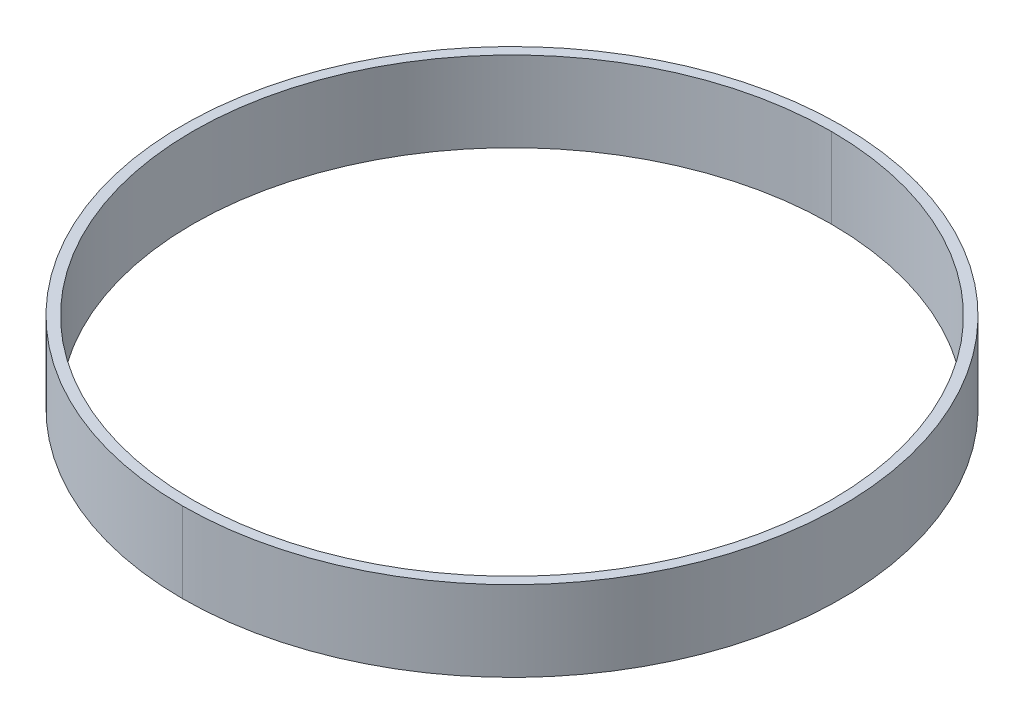
ISO-10303-21;
HEADER;
FILE_DESCRIPTION(('STEP AP214'),'2;1');
FILE_NAME('part.step','',(''),(''),'','','');
FILE_SCHEMA(('AUTOMOTIVE_DESIGN { 1 0 10303 214 1 1 1 1 }'));
ENDSEC;
DATA;
#1=APPLICATION_CONTEXT('core data for automotive mechanical design processes');
#2=APPLICATION_PROTOCOL_DEFINITION('international standard','automotive_design',2000,#1);
#3=PRODUCT_CONTEXT('',#1,'mechanical');
#4=PRODUCT('Part','Part','',(#3));
#5=PRODUCT_RELATED_PRODUCT_CATEGORY('part','',(#4));
#6=PRODUCT_DEFINITION_FORMATION('','',#4);
#7=PRODUCT_DEFINITION_CONTEXT('part definition',#1,'design');
#8=PRODUCT_DEFINITION('design','',#6,#7);
#9=PRODUCT_DEFINITION_SHAPE('','',#8);
#10=(LENGTH_UNIT() NAMED_UNIT(*) SI_UNIT(.MILLI.,.METRE.));
#11=(NAMED_UNIT(*) PLANE_ANGLE_UNIT() SI_UNIT($,.RADIAN.));
#12=(NAMED_UNIT(*) SI_UNIT($,.STERADIAN.) SOLID_ANGLE_UNIT());
#13=UNCERTAINTY_MEASURE_WITH_UNIT(LENGTH_MEASURE(1.E-05),#10,'distance_accuracy_value','');
#14=(GEOMETRIC_REPRESENTATION_CONTEXT(3) GLOBAL_UNCERTAINTY_ASSIGNED_CONTEXT((#13)) GLOBAL_UNIT_ASSIGNED_CONTEXT((#10,
#11,#12)) REPRESENTATION_CONTEXT('',''));
#15=CARTESIAN_POINT('',(0.,0.,0.));
#16=DIRECTION('',(0.,0.,1.));
#17=DIRECTION('',(1.,0.,0.));
#18=AXIS2_PLACEMENT_3D('',#15,#16,#17);
#19=CARTESIAN_POINT('',(0.,8.,0.));
#20=DIRECTION('',(0.,-1.,0.));
#21=DIRECTION('',(0.,0.,-1.));
#22=AXIS2_PLACEMENT_3D('',#19,#20,#21);
#23=CYLINDRICAL_SURFACE('',#22,31.);
#24=CARTESIAN_POINT('',(0.,7.8,0.));
#25=DIRECTION('',(0.,-1.,0.));
#26=DIRECTION('',(0.,0.,1.));
#27=AXIS2_PLACEMENT_3D('',#24,#25,#26);
#28=CIRCLE('',#27,31.);
#29=CARTESIAN_POINT('',(0.,7.8,31.));
#30=VERTEX_POINT('',#29);
#31=CARTESIAN_POINT('',(0.,7.8,-31.));
#32=VERTEX_POINT('',#31);
#33=EDGE_CURVE('E91',#30,#32,#28,.T.);
#34=ORIENTED_EDGE('',*,*,#33,.F.);
#35=DIRECTION('',(0.,-1.,0.));
#36=VECTOR('',#35,1.);
#37=CARTESIAN_POINT('',(0.,8.,31.));
#38=LINE('',#37,#36);
#39=CARTESIAN_POINT('',(0.,0.,31.));
#40=VERTEX_POINT('',#39);
#41=EDGE_CURVE('E39',#30,#40,#38,.T.);
#42=ORIENTED_EDGE('',*,*,#41,.T.);
#43=CARTESIAN_POINT('',(0.,0.,0.));
#44=DIRECTION('',(0.,1.,0.));
#45=DIRECTION('',(0.,0.,1.));
#46=AXIS2_PLACEMENT_3D('',#43,#44,#45);
#47=CIRCLE('',#46,31.);
#48=CARTESIAN_POINT('',(0.,0.,-31.));
#49=VERTEX_POINT('',#48);
#50=EDGE_CURVE('E112',#49,#40,#47,.T.);
#51=ORIENTED_EDGE('',*,*,#50,.F.);
#52=DIRECTION('',(0.,-1.,0.));
#53=VECTOR('',#52,1.);
#54=CARTESIAN_POINT('',(0.,8.,-31.));
#55=LINE('',#54,#53);
#56=EDGE_CURVE('E19',#32,#49,#55,.T.);
#57=ORIENTED_EDGE('',*,*,#56,.F.);
#58=EDGE_LOOP('',(#34,#42,#51,#57));
#59=FACE_BOUND('',#58,.T.);
#60=ADVANCED_FACE('F16',(#59),#23,.F.);
#61=CARTESIAN_POINT('',(0.,8.,0.));
#62=DIRECTION('',(0.,-1.,0.));
#63=DIRECTION('',(0.,0.,-1.));
#64=AXIS2_PLACEMENT_3D('',#61,#62,#63);
#65=CYLINDRICAL_SURFACE('',#64,32.);
#66=DIRECTION('',(0.,-1.,0.));
#67=VECTOR('',#66,1.);
#68=CARTESIAN_POINT('',(0.,8.,-32.));
#69=LINE('',#68,#67);
#70=CARTESIAN_POINT('',(0.,7.8,-32.));
#71=VERTEX_POINT('',#70);
#72=CARTESIAN_POINT('',(0.,0.,-32.));
#73=VERTEX_POINT('',#72);
#74=EDGE_CURVE('E10',#71,#73,#69,.T.);
#75=ORIENTED_EDGE('',*,*,#74,.F.);
#76=CARTESIAN_POINT('',(0.,7.8,0.));
#77=DIRECTION('',(0.,1.,0.));
#78=DIRECTION('',(0.,0.,1.));
#79=AXIS2_PLACEMENT_3D('',#76,#77,#78);
#80=CIRCLE('',#79,32.);
#81=CARTESIAN_POINT('',(0.,7.8,32.));
#82=VERTEX_POINT('',#81);
#83=EDGE_CURVE('E89',#82,#71,#80,.T.);
#84=ORIENTED_EDGE('',*,*,#83,.F.);
#85=DIRECTION('',(0.,-1.,0.));
#86=VECTOR('',#85,1.);
#87=CARTESIAN_POINT('',(0.,8.,32.));
#88=LINE('',#87,#86);
#89=CARTESIAN_POINT('',(0.,0.,32.));
#90=VERTEX_POINT('',#89);
#91=EDGE_CURVE('E25',#82,#90,#88,.T.);
#92=ORIENTED_EDGE('',*,*,#91,.T.);
#93=CARTESIAN_POINT('',(0.,0.,0.));
#94=DIRECTION('',(0.,1.,0.));
#95=DIRECTION('',(1.,0.,0.));
#96=AXIS2_PLACEMENT_3D('',#93,#94,#95);
#97=CIRCLE('',#96,32.);
#98=EDGE_CURVE('E103',#90,#73,#97,.T.);
#99=ORIENTED_EDGE('',*,*,#98,.T.);
#100=EDGE_LOOP('',(#75,#84,#92,#99));
#101=FACE_BOUND('',#100,.T.);
#102=ADVANCED_FACE('F93',(#101),#65,.T.);
#103=CARTESIAN_POINT('',(0.,8.,0.));
#104=DIRECTION('',(0.,-1.,0.));
#105=DIRECTION('',(0.,0.,-1.));
#106=AXIS2_PLACEMENT_3D('',#103,#104,#105);
#107=CYLINDRICAL_SURFACE('',#106,32.);
#108=ORIENTED_EDGE('',*,*,#91,.F.);
#109=CARTESIAN_POINT('',(0.,7.8,0.));
#110=DIRECTION('',(0.,1.,0.));
#111=DIRECTION('',(0.,0.,1.));
#112=AXIS2_PLACEMENT_3D('',#109,#110,#111);
#113=CIRCLE('',#112,32.);
#114=EDGE_CURVE('E77',#71,#82,#113,.T.);
#115=ORIENTED_EDGE('',*,*,#114,.F.);
#116=ORIENTED_EDGE('',*,*,#74,.T.);
#117=CARTESIAN_POINT('',(0.,0.,0.));
#118=DIRECTION('',(0.,1.,0.));
#119=DIRECTION('',(1.,0.,0.));
#120=AXIS2_PLACEMENT_3D('',#117,#118,#119);
#121=CIRCLE('',#120,32.);
#122=EDGE_CURVE('E80',#73,#90,#121,.T.);
#123=ORIENTED_EDGE('',*,*,#122,.T.);
#124=EDGE_LOOP('',(#108,#115,#116,#123));
#125=FACE_BOUND('',#124,.T.);
#126=ADVANCED_FACE('F76',(#125),#107,.T.);
#127=CARTESIAN_POINT('',(0.,8.,0.));
#128=DIRECTION('',(0.,-1.,0.));
#129=DIRECTION('',(0.,0.,-1.));
#130=AXIS2_PLACEMENT_3D('',#127,#128,#129);
#131=CYLINDRICAL_SURFACE('',#130,31.);
#132=CARTESIAN_POINT('',(0.,7.8,0.));
#133=DIRECTION('',(0.,-1.,0.));
#134=DIRECTION('',(0.,0.,1.));
#135=AXIS2_PLACEMENT_3D('',#132,#133,#134);
#136=CIRCLE('',#135,31.);
#137=EDGE_CURVE('E104',#32,#30,#136,.T.);
#138=ORIENTED_EDGE('',*,*,#137,.F.);
#139=ORIENTED_EDGE('',*,*,#56,.T.);
#140=CARTESIAN_POINT('',(0.,0.,0.));
#141=DIRECTION('',(0.,1.,0.));
#142=DIRECTION('',(0.,0.,1.));
#143=AXIS2_PLACEMENT_3D('',#140,#141,#142);
#144=CIRCLE('',#143,31.);
#145=EDGE_CURVE('E116',#40,#49,#144,.T.);
#146=ORIENTED_EDGE('',*,*,#145,.F.);
#147=ORIENTED_EDGE('',*,*,#41,.F.);
#148=EDGE_LOOP('',(#138,#139,#146,#147));
#149=FACE_BOUND('',#148,.T.);
#150=ADVANCED_FACE('F146',(#149),#131,.F.);
#151=CARTESIAN_POINT('',(0.,0.,0.));
#152=DIRECTION('',(0.,1.,0.));
#153=DIRECTION('',(1.,0.,0.));
#154=AXIS2_PLACEMENT_3D('',#151,#152,#153);
#155=PLANE('',#154);
#156=ORIENTED_EDGE('',*,*,#50,.T.);
#157=ORIENTED_EDGE('',*,*,#145,.T.);
#158=EDGE_LOOP('',(#156,#157));
#159=FACE_BOUND('',#158,.T.);
#160=ORIENTED_EDGE('',*,*,#122,.F.);
#161=ORIENTED_EDGE('',*,*,#98,.F.);
#162=EDGE_LOOP('',(#160,#161));
#163=FACE_BOUND('',#162,.T.);
#164=ADVANCED_FACE('F134',(#159,#163),#155,.F.);
#165=CARTESIAN_POINT('',(0.,7.8,0.));
#166=DIRECTION('',(0.,1.,0.));
#167=DIRECTION('',(1.,0.,0.));
#168=AXIS2_PLACEMENT_3D('',#165,#166,#167);
#169=PLANE('',#168);
#170=ORIENTED_EDGE('',*,*,#33,.T.);
#171=ORIENTED_EDGE('',*,*,#137,.T.);
#172=EDGE_LOOP('',(#170,#171));
#173=FACE_BOUND('',#172,.T.);
#174=ORIENTED_EDGE('',*,*,#83,.T.);
#175=ORIENTED_EDGE('',*,*,#114,.T.);
#176=EDGE_LOOP('',(#174,#175));
#177=FACE_BOUND('',#176,.T.);
#178=ADVANCED_FACE('F88',(#173,#177),#169,.T.);
#179=CLOSED_SHELL('',(#60,#102,#126,#150,#164,#178));
#180=MANIFOLD_SOLID_BREP('B1',#179);
#181=ADVANCED_BREP_SHAPE_REPRESENTATION('',(#18,#180),#14);
#182=SHAPE_DEFINITION_REPRESENTATION(#9,#181);
ENDSEC;
END-ISO-10303-21;
